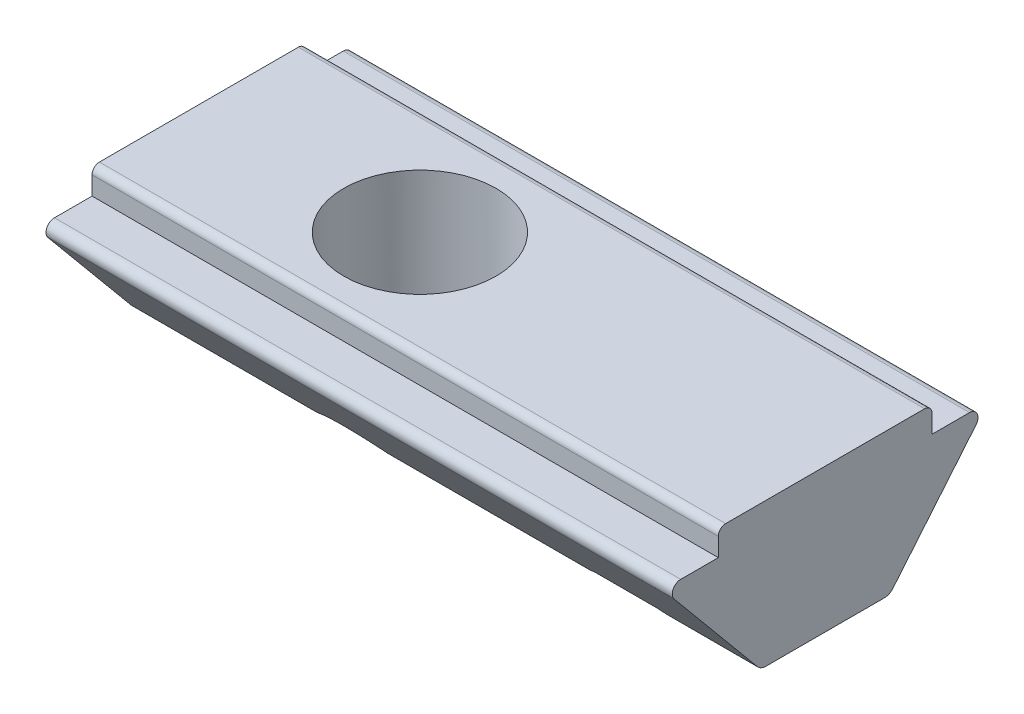
ISO-10303-21;
HEADER;
FILE_DESCRIPTION(('STEP AP214'),'2;1');
FILE_NAME('part.step','',(''),(''),'','','');
FILE_SCHEMA(('AUTOMOTIVE_DESIGN { 1 0 10303 214 1 1 1 1 }'));
ENDSEC;
DATA;
#1=APPLICATION_CONTEXT('core data for automotive mechanical design processes');
#2=APPLICATION_PROTOCOL_DEFINITION('international standard','automotive_design',2000,#1);
#3=PRODUCT_CONTEXT('',#1,'mechanical');
#4=PRODUCT('Part','Part','',(#3));
#5=PRODUCT_RELATED_PRODUCT_CATEGORY('part','',(#4));
#6=PRODUCT_DEFINITION_FORMATION('','',#4);
#7=PRODUCT_DEFINITION_CONTEXT('part definition',#1,'design');
#8=PRODUCT_DEFINITION('design','',#6,#7);
#9=PRODUCT_DEFINITION_SHAPE('','',#8);
#10=(LENGTH_UNIT() NAMED_UNIT(*) SI_UNIT(.MILLI.,.METRE.));
#11=(NAMED_UNIT(*) PLANE_ANGLE_UNIT() SI_UNIT($,.RADIAN.));
#12=(NAMED_UNIT(*) SI_UNIT($,.STERADIAN.) SOLID_ANGLE_UNIT());
#13=UNCERTAINTY_MEASURE_WITH_UNIT(LENGTH_MEASURE(1.E-05),#10,'distance_accuracy_value','');
#14=(GEOMETRIC_REPRESENTATION_CONTEXT(3) GLOBAL_UNCERTAINTY_ASSIGNED_CONTEXT((#13)) GLOBAL_UNIT_ASSIGNED_CONTEXT((#10,
#11,#12)) REPRESENTATION_CONTEXT('',''));
#15=CARTESIAN_POINT('',(0.,0.,0.));
#16=DIRECTION('',(0.,0.,1.));
#17=DIRECTION('',(1.,0.,0.));
#18=AXIS2_PLACEMENT_3D('',#15,#16,#17);
#19=CARTESIAN_POINT('',(11.,-3.9,1.75));
#20=DIRECTION('',(0.,1.,0.));
#21=DIRECTION('',(0.,0.,1.));
#22=AXIS2_PLACEMENT_3D('',#19,#20,#21);
#23=PLANE('',#22);
#24=DIRECTION('',(-1.,0.,0.));
#25=VECTOR('',#24,1.);
#26=CARTESIAN_POINT('',(11.,-3.9,1.60927283533169));
#27=LINE('',#26,#25);
#28=CARTESIAN_POINT('',(6.15083694778447,-3.9,1.60927283533169));
#29=VERTEX_POINT('',#28);
#30=CARTESIAN_POINT('',(1.29720080999956,-3.9,1.60927283533169));
#31=VERTEX_POINT('',#30);
#32=EDGE_CURVE('E365',#29,#31,#27,.T.);
#33=ORIENTED_EDGE('',*,*,#32,.T.);
#34=CARTESIAN_POINT('',(0.,-3.9,0.));
#35=DIRECTION('',(0.,1.,0.));
#36=DIRECTION('',(0.,0.,1.));
#37=AXIS2_PLACEMENT_3D('',#34,#35,#36);
#38=CIRCLE('',#37,2.067);
#39=CARTESIAN_POINT('',(1.29720080999955,-3.9,-1.60927283533169));
#40=VERTEX_POINT('',#39);
#41=EDGE_CURVE('E64',#31,#40,#38,.T.);
#42=ORIENTED_EDGE('',*,*,#41,.T.);
#43=DIRECTION('',(-1.,0.,0.));
#44=VECTOR('',#43,1.);
#45=CARTESIAN_POINT('',(11.,-3.9,-1.60927283533169));
#46=LINE('',#45,#44);
#47=CARTESIAN_POINT('',(6.15083694778448,-3.9,-1.60927283533169));
#48=VERTEX_POINT('',#47);
#49=EDGE_CURVE('E71',#40,#48,#46,.F.);
#50=ORIENTED_EDGE('',*,*,#49,.T.);
#51=CARTESIAN_POINT('',(7.5,-3.9,0.));
#52=DIRECTION('',(0.,1.,0.));
#53=DIRECTION('',(0.,0.,1.));
#54=AXIS2_PLACEMENT_3D('',#51,#52,#53);
#55=CIRCLE('',#54,2.1);
#56=EDGE_CURVE('E359',#48,#29,#55,.T.);
#57=ORIENTED_EDGE('',*,*,#56,.T.);
#58=EDGE_LOOP('',(#33,#42,#50,#57));
#59=FACE_BOUND('',#58,.T.);
#60=ADVANCED_FACE('F43',(#59),#23,.F.);
#61=CARTESIAN_POINT('',(11.,-3.6,-1.60927283533169));
#62=DIRECTION('',(-1.,0.,0.));
#63=DIRECTION('',(0.,0.,1.));
#64=AXIS2_PLACEMENT_3D('',#61,#62,#63);
#65=CYLINDRICAL_SURFACE('',#64,0.3);
#66=CARTESIAN_POINT('',(-1.29720080999955,-3.9,-1.60927283533169));
#67=CARTESIAN_POINT('',(-1.27974293237476,-3.89999128934075,-1.62334724323147));
#68=CARTESIAN_POINT('',(-1.2620737162754,-3.89901135164048,-1.63711891595062));
#69=CARTESIAN_POINT('',(-1.22642965644565,-3.89528120129688,-1.66398801441038));
#70=CARTESIAN_POINT('',(-1.20845504037879,-3.89253225547317,-1.67708591540852));
#71=CARTESIAN_POINT('',(-1.1549406520226,-3.88203082036834,-1.71478116309034));
#72=CARTESIAN_POINT('',(-1.1190971994342,-3.87200825235047,-1.73835221681893));
#73=CARTESIAN_POINT('',(-1.05957824577181,-3.85065115458066,-1.77498300902969));
#74=CARTESIAN_POINT('',(-1.03585557140469,-3.84088535441787,-1.7889158503905));
#75=CARTESIAN_POINT('',(-1.00043401580829,-3.82418669508058,-1.80881374381069));
#76=CARTESIAN_POINT('',(-0.988576784850685,-3.8182329207292,-1.8153187211507));
#77=CARTESIAN_POINT('',(-0.965041137451065,-3.80558184134619,-1.82793984997824));
#78=CARTESIAN_POINT('',(-0.95336285554577,-3.79888400539671,-1.83405571886375));
#79=CARTESIAN_POINT('',(-0.941817360790472,-3.79178475893633,-1.83996441783902));
#80=B_SPLINE_CURVE_WITH_KNOTS('',3,(#66,#67,#68,#69,#70,#71,#72,#73,#74,#75,#76,#77,#78,#79),
.UNSPECIFIED.,.F.,.F.,(4,2,2,2,2,2,4),(0.,0.0672080338937752,0.134367992342279,
0.265975595194617,0.353421910220517,0.39772945333734,0.442068817235654),.UNSPECIFIED.);
#81=CARTESIAN_POINT('',(-1.29720080999955,-3.9,-1.60927283533169));
#82=VERTEX_POINT('',#81);
#83=CARTESIAN_POINT('',(-0.941817360790466,-3.79178475893633,-1.83996441783902));
#84=VERTEX_POINT('',#83);
#85=EDGE_CURVE('E347',#82,#84,#80,.T.);
#86=ORIENTED_EDGE('',*,*,#85,.F.);
#87=CARTESIAN_POINT('',(-6.,-3.9,-1.60927283533169));
#88=VERTEX_POINT('',#87);
#89=EDGE_CURVE('E371',#88,#82,#46,.F.);
#90=ORIENTED_EDGE('',*,*,#89,.F.);
#91=CARTESIAN_POINT('',(-6.,-3.6,-1.60927283533169));
#92=DIRECTION('',(-1.,0.,0.));
#93=DIRECTION('',(0.,0.,1.));
#94=AXIS2_PLACEMENT_3D('',#91,#92,#93);
#95=CIRCLE('',#94,0.3);
#96=CARTESIAN_POINT('',(-6.,-3.79178475893633,-1.83996441783902));
#97=VERTEX_POINT('',#96);
#98=EDGE_CURVE('E370',#97,#88,#95,.T.);
#99=ORIENTED_EDGE('',*,*,#98,.F.);
#100=DIRECTION('',(-1.,0.,0.));
#101=VECTOR('',#100,1.);
#102=CARTESIAN_POINT('',(11.,-3.79178475893633,-1.83996441783902));
#103=LINE('',#102,#101);
#104=EDGE_CURVE('E241',#84,#97,#103,.T.);
#105=ORIENTED_EDGE('',*,*,#104,.F.);
#106=EDGE_LOOP('',(#86,#90,#99,#105));
#107=FACE_BOUND('',#106,.T.);
#108=ADVANCED_FACE('F494',(#107),#65,.T.);
#109=CARTESIAN_POINT('',(11.,-3.6,1.60927283533169));
#110=DIRECTION('',(-1.,0.,0.));
#111=DIRECTION('',(0.,0.,1.));
#112=AXIS2_PLACEMENT_3D('',#109,#110,#111);
#113=CYLINDRICAL_SURFACE('',#112,0.3);
#114=CARTESIAN_POINT('',(-0.941817360790473,-3.79178475893633,1.83996441783901));
#115=CARTESIAN_POINT('',(-0.959536967771565,-3.80264927398413,1.83089913523369));
#116=CARTESIAN_POINT('',(-0.977543826134357,-3.81260387629664,1.82135454319004));
#117=CARTESIAN_POINT('',(-1.0138983493778,-3.83083897464804,1.80136737059737));
#118=CARTESIAN_POINT('',(-1.0322459078334,-3.83911998417495,1.79092506688812));
#119=CARTESIAN_POINT('',(-1.06868991680062,-3.85400919668802,1.76941547577826));
#120=CARTESIAN_POINT('',(-1.08678401745704,-3.8606476347989,1.75836493608639));
#121=CARTESIAN_POINT('',(-1.12295598491964,-3.8724622644158,1.7354875396833));
#122=CARTESIAN_POINT('',(-1.14103385249653,-3.8776385294479,1.72366072204446));
#123=CARTESIAN_POINT('',(-1.18230339098004,-3.88776731923938,1.69571039796934));
#124=CARTESIAN_POINT('',(-1.2054537720449,-3.89221726967314,1.67933737075325));
#125=CARTESIAN_POINT('',(-1.251596475979,-3.8983382028379,1.64524687968425));
#126=CARTESIAN_POINT('',(-1.2745826924218,-3.89997177931288,1.62751453832146));
#127=CARTESIAN_POINT('',(-1.29720080999956,-3.9,1.60927283533169));
#128=B_SPLINE_CURVE_WITH_KNOTS('',3,(#114,#115,#116,#117,#118,#119,#120,#121,#122,#123,#124,
#125,#126,#127),.UNSPECIFIED.,.F.,.F.,(4,2,2,2,2,2,4),(0.,0.0679738673511678,0.135926847343073,
0.202516136311645,0.269102076209518,0.355046711932197,0.442124289355897),.UNSPECIFIED.);
#129=CARTESIAN_POINT('',(-0.94181736079047,-3.79178475893633,1.83996441783902));
#130=VERTEX_POINT('',#129);
#131=CARTESIAN_POINT('',(-1.29720080999956,-3.9,1.60927283533169));
#132=VERTEX_POINT('',#131);
#133=EDGE_CURVE('E11',#130,#132,#128,.T.);
#134=ORIENTED_EDGE('',*,*,#133,.F.);
#135=DIRECTION('',(-1.,0.,0.));
#136=VECTOR('',#135,1.);
#137=CARTESIAN_POINT('',(11.,-3.79178475893633,1.83996441783902));
#138=LINE('',#137,#136);
#139=CARTESIAN_POINT('',(-6.,-3.79178475893633,1.83996441783902));
#140=VERTEX_POINT('',#139);
#141=EDGE_CURVE('E225',#140,#130,#138,.F.);
#142=ORIENTED_EDGE('',*,*,#141,.F.);
#143=CARTESIAN_POINT('',(-6.,-3.6,1.60927283533169));
#144=DIRECTION('',(-1.,0.,0.));
#145=DIRECTION('',(0.,0.,1.));
#146=AXIS2_PLACEMENT_3D('',#143,#144,#145);
#147=CIRCLE('',#146,0.3);
#148=CARTESIAN_POINT('',(-6.,-3.9,1.60927283533169));
#149=VERTEX_POINT('',#148);
#150=EDGE_CURVE('E234',#149,#140,#147,.T.);
#151=ORIENTED_EDGE('',*,*,#150,.F.);
#152=EDGE_CURVE('E368',#132,#149,#27,.T.);
#153=ORIENTED_EDGE('',*,*,#152,.F.);
#154=EDGE_LOOP('',(#134,#142,#151,#153));
#155=FACE_BOUND('',#154,.T.);
#156=ADVANCED_FACE('F313',(#155),#113,.T.);
#157=CARTESIAN_POINT('',(7.5,-3.7,0.));
#158=DIRECTION('',(0.,-1.,0.));
#159=DIRECTION('',(0.,0.,-1.));
#160=AXIS2_PLACEMENT_3D('',#157,#158,#159);
#161=PLANE('',#160);
#162=DIRECTION('',(-1.,0.,0.));
#163=VECTOR('',#162,1.);
#164=CARTESIAN_POINT('',(11.,-3.7,1.9162694033756));
#165=LINE('',#164,#163);
#166=CARTESIAN_POINT('',(8.35901779590794,-3.7,1.9162694033756));
#167=VERTEX_POINT('',#166);
#168=CARTESIAN_POINT('',(6.64098220409206,-3.7,1.9162694033756));
#169=VERTEX_POINT('',#168);
#170=EDGE_CURVE('E448',#167,#169,#165,.T.);
#171=ORIENTED_EDGE('',*,*,#170,.T.);
#172=CARTESIAN_POINT('',(7.5,-3.7,0.));
#173=DIRECTION('',(0.,1.,0.));
#174=DIRECTION('',(0.,0.,1.));
#175=AXIS2_PLACEMENT_3D('',#172,#173,#174);
#176=CIRCLE('',#175,2.1);
#177=CARTESIAN_POINT('',(6.64098220409206,-3.7,-1.9162694033756));
#178=VERTEX_POINT('',#177);
#179=EDGE_CURVE('E356',#178,#169,#176,.T.);
#180=ORIENTED_EDGE('',*,*,#179,.F.);
#181=DIRECTION('',(1.,0.,0.));
#182=VECTOR('',#181,1.);
#183=CARTESIAN_POINT('',(11.,-3.7,-1.9162694033756));
#184=LINE('',#183,#182);
#185=CARTESIAN_POINT('',(8.35901779590794,-3.7,-1.9162694033756));
#186=VERTEX_POINT('',#185);
#187=EDGE_CURVE('E216',#178,#186,#184,.T.);
#188=ORIENTED_EDGE('',*,*,#187,.T.);
#189=EDGE_CURVE('E357',#167,#186,#176,.T.);
#190=ORIENTED_EDGE('',*,*,#189,.F.);
#191=EDGE_LOOP('',(#171,#180,#188,#190));
#192=FACE_BOUND('',#191,.T.);
#193=CARTESIAN_POINT('',(7.5,-3.7,0.));
#194=DIRECTION('',(0.,1.,0.));
#195=DIRECTION('',(0.,0.,1.));
#196=AXIS2_PLACEMENT_3D('',#193,#194,#195);
#197=CIRCLE('',#196,1.73205080756888);
#198=CARTESIAN_POINT('',(7.5,-3.7,1.73205080756888));
#199=VERTEX_POINT('',#198);
#200=EDGE_CURVE('E353',#199,#199,#197,.T.);
#201=ORIENTED_EDGE('',*,*,#200,.T.);
#202=EDGE_LOOP('',(#201));
#203=FACE_BOUND('',#202,.T.);
#204=ADVANCED_FACE('F288',(#192,#203),#161,.T.);
#205=CARTESIAN_POINT('',(11.,-1.07703498185118,4.09686354658895));
#206=DIRECTION('',(0.,0.639282529787763,-0.768971941691085));
#207=DIRECTION('',(0.,0.768971941691085,0.639282529787763));
#208=AXIS2_PLACEMENT_3D('',#205,#206,#207);
#209=PLANE('',#208);
#210=ORIENTED_EDGE('',*,*,#141,.T.);
#211=CARTESIAN_POINT('',(0.,-6.00501747702407,0.));
#212=DIRECTION('',(0.,0.639282529787763,-0.768971941691085));
#213=DIRECTION('',(0.,0.768971941691085,0.639282529787763));
#214=AXIS2_PLACEMENT_3D('',#211,#212,#213);
#215=ELLIPSE('',#214,3.23331219560501,2.067);
#216=CARTESIAN_POINT('',(0.941817360790473,-3.79178475893633,1.83996441783901));
#217=VERTEX_POINT('',#216);
#218=EDGE_CURVE('E210',#130,#217,#215,.T.);
#219=ORIENTED_EDGE('',*,*,#218,.T.);
#220=CARTESIAN_POINT('',(6.48780884162805,-3.79178475893633,1.83996441783901));
#221=VERTEX_POINT('',#220);
#222=EDGE_CURVE('E221',#217,#221,#138,.F.);
#223=ORIENTED_EDGE('',*,*,#222,.T.);
#224=CARTESIAN_POINT('',(7.5,-6.00501747702407,0.));
#225=DIRECTION('',(0.,0.639282529787763,-0.768971941691085));
#226=DIRECTION('',(0.,0.768971941691085,0.639282529787763));
#227=AXIS2_PLACEMENT_3D('',#224,#225,#226);
#228=ELLIPSE('',#227,3.28493256447534,2.1);
#229=EDGE_CURVE('E303',#169,#221,#228,.F.);
#230=ORIENTED_EDGE('',*,*,#229,.F.);
#231=ORIENTED_EDGE('',*,*,#170,.F.);
#232=CARTESIAN_POINT('',(8.51219115837194,-3.79178475893633,1.83996441783901));
#233=VERTEX_POINT('',#232);
#234=EDGE_CURVE('E469',#233,#167,#228,.F.);
#235=ORIENTED_EDGE('',*,*,#234,.F.);
#236=CARTESIAN_POINT('',(11.,-3.79178475893633,1.83996441783902));
#237=VERTEX_POINT('',#236);
#238=EDGE_CURVE('E231',#233,#237,#138,.F.);
#239=ORIENTED_EDGE('',*,*,#238,.T.);
#240=DIRECTION('',(0.,-0.768971941691085,-0.639282529787763));
#241=VECTOR('',#240,1.);
#242=CARTESIAN_POINT('',(11.,-1.07703498185118,4.09686354658895));
#243=LINE('',#242,#241);
#244=CARTESIAN_POINT('',(11.,-1.07703498185118,4.09686354658895));
#245=VERTEX_POINT('',#244);
#246=EDGE_CURVE('E456',#245,#237,#243,.T.);
#247=ORIENTED_EDGE('',*,*,#246,.F.);
#248=DIRECTION('',(-1.,0.,0.));
#249=VECTOR('',#248,1.);
#250=CARTESIAN_POINT('',(11.,-1.07703498185118,4.09686354658895));
#251=LINE('',#250,#249);
#252=CARTESIAN_POINT('',(-6.,-1.07703498185118,4.09686354658895));
#253=VERTEX_POINT('',#252);
#254=EDGE_CURVE('E391',#245,#253,#251,.T.);
#255=ORIENTED_EDGE('',*,*,#254,.T.);
#256=DIRECTION('',(0.,-0.768971941691085,-0.639282529787763));
#257=VECTOR('',#256,1.);
#258=CARTESIAN_POINT('',(-6.,-1.07703498185118,4.09686354658895));
#259=LINE('',#258,#257);
#260=EDGE_CURVE('E384',#253,#140,#259,.T.);
#261=ORIENTED_EDGE('',*,*,#260,.T.);
#262=EDGE_LOOP('',(#210,#219,#223,#230,#231,#235,#239,#247,#255,#261));
#263=FACE_BOUND('',#262,.T.);
#264=ADVANCED_FACE('F219',(#263),#209,.F.);
#265=ORIENTED_EDGE('',*,*,#89,.T.);
#266=EDGE_CURVE('E346',#82,#132,#38,.T.);
#267=ORIENTED_EDGE('',*,*,#266,.T.);
#268=ORIENTED_EDGE('',*,*,#152,.T.);
#269=DIRECTION('',(0.,0.,-1.));
#270=VECTOR('',#269,1.);
#271=CARTESIAN_POINT('',(-6.,-3.9,1.75));
#272=LINE('',#271,#270);
#273=EDGE_CURVE('E385',#149,#88,#272,.T.);
#274=ORIENTED_EDGE('',*,*,#273,.T.);
#275=EDGE_LOOP('',(#265,#267,#268,#274));
#276=FACE_BOUND('',#275,.T.);
#277=ADVANCED_FACE('F398',(#276),#23,.F.);
#278=CARTESIAN_POINT('',(8.84916305221553,-3.9,1.60927283533169));
#279=VERTEX_POINT('',#278);
#280=CARTESIAN_POINT('',(8.84916305221552,-3.9,-1.60927283533169));
#281=VERTEX_POINT('',#280);
#282=EDGE_CURVE('E360',#279,#281,#55,.T.);
#283=ORIENTED_EDGE('',*,*,#282,.T.);
#284=CARTESIAN_POINT('',(11.,-3.9,-1.60927283533169));
#285=VERTEX_POINT('',#284);
#286=EDGE_CURVE('E405',#281,#285,#46,.F.);
#287=ORIENTED_EDGE('',*,*,#286,.T.);
#288=DIRECTION('',(0.,0.,-1.));
#289=VECTOR('',#288,1.);
#290=CARTESIAN_POINT('',(11.,-3.9,1.75));
#291=LINE('',#290,#289);
#292=CARTESIAN_POINT('',(11.,-3.9,1.60927283533169));
#293=VERTEX_POINT('',#292);
#294=EDGE_CURVE('E454',#293,#285,#291,.T.);
#295=ORIENTED_EDGE('',*,*,#294,.F.);
#296=EDGE_CURVE('E367',#293,#279,#27,.T.);
#297=ORIENTED_EDGE('',*,*,#296,.T.);
#298=EDGE_LOOP('',(#283,#287,#295,#297));
#299=FACE_BOUND('',#298,.T.);
#300=ADVANCED_FACE('F482',(#299),#23,.F.);
#301=CARTESIAN_POINT('',(11.,-3.9,-1.75));
#302=DIRECTION('',(0.,0.639282529787763,0.768971941691085));
#303=DIRECTION('',(0.,-0.768971941691086,0.639282529787763));
#304=AXIS2_PLACEMENT_3D('',#301,#302,#303);
#305=PLANE('',#304);
#306=CARTESIAN_POINT('',(6.48780884162806,-3.79178475893633,-1.83996441783902));
#307=VERTEX_POINT('',#306);
#308=CARTESIAN_POINT('',(0.941817360790472,-3.79178475893633,-1.83996441783902));
#309=VERTEX_POINT('',#308);
#310=EDGE_CURVE('E246',#307,#309,#103,.T.);
#311=ORIENTED_EDGE('',*,*,#310,.T.);
#312=CARTESIAN_POINT('',(0.,-6.00501747702407,0.));
#313=DIRECTION('',(0.,0.639282529787763,0.768971941691085));
#314=DIRECTION('',(0.,0.768971941691086,-0.639282529787763));
#315=AXIS2_PLACEMENT_3D('',#312,#313,#314);
#316=ELLIPSE('',#315,3.23331219560501,2.067);
#317=EDGE_CURVE('E344',#309,#84,#316,.T.);
#318=ORIENTED_EDGE('',*,*,#317,.T.);
#319=ORIENTED_EDGE('',*,*,#104,.T.);
#320=DIRECTION('',(0.,0.768971941691086,-0.639282529787763));
#321=VECTOR('',#320,1.);
#322=CARTESIAN_POINT('',(-6.,-3.9,-1.75));
#323=LINE('',#322,#321);
#324=CARTESIAN_POINT('',(-6.,-1.07703498185118,-4.09686354658895));
#325=VERTEX_POINT('',#324);
#326=EDGE_CURVE('E434',#97,#325,#323,.T.);
#327=ORIENTED_EDGE('',*,*,#326,.T.);
#328=DIRECTION('',(-1.,0.,0.));
#329=VECTOR('',#328,1.);
#330=CARTESIAN_POINT('',(11.,-1.07703498185118,-4.09686354658895));
#331=LINE('',#330,#329);
#332=CARTESIAN_POINT('',(11.,-1.07703498185118,-4.09686354658895));
#333=VERTEX_POINT('',#332);
#334=EDGE_CURVE('E419',#333,#325,#331,.T.);
#335=ORIENTED_EDGE('',*,*,#334,.F.);
#336=DIRECTION('',(0.,0.768971941691086,-0.639282529787763));
#337=VECTOR('',#336,1.);
#338=CARTESIAN_POINT('',(11.,-3.9,-1.75));
#339=LINE('',#338,#337);
#340=CARTESIAN_POINT('',(11.,-3.79178475893633,-1.83996441783902));
#341=VERTEX_POINT('',#340);
#342=EDGE_CURVE('E452',#341,#333,#339,.T.);
#343=ORIENTED_EDGE('',*,*,#342,.F.);
#344=CARTESIAN_POINT('',(8.51219115837194,-3.79178475893633,-1.83996441783902));
#345=VERTEX_POINT('',#344);
#346=EDGE_CURVE('E242',#341,#345,#103,.T.);
#347=ORIENTED_EDGE('',*,*,#346,.T.);
#348=CARTESIAN_POINT('',(7.5,-6.00501747702407,0.));
#349=DIRECTION('',(0.,0.639282529787763,0.768971941691085));
#350=DIRECTION('',(0.,0.768971941691086,-0.639282529787763));
#351=AXIS2_PLACEMENT_3D('',#348,#349,#350);
#352=ELLIPSE('',#351,3.28493256447534,2.1);
#353=EDGE_CURVE('E304',#186,#345,#352,.F.);
#354=ORIENTED_EDGE('',*,*,#353,.F.);
#355=ORIENTED_EDGE('',*,*,#187,.F.);
#356=EDGE_CURVE('E305',#307,#178,#352,.F.);
#357=ORIENTED_EDGE('',*,*,#356,.F.);
#358=EDGE_LOOP('',(#311,#318,#319,#327,#335,#343,#347,#354,#355,#357));
#359=FACE_BOUND('',#358,.T.);
#360=ADVANCED_FACE('F311',(#359),#305,.F.);
#361=ORIENTED_EDGE('',*,*,#238,.F.);
#362=CARTESIAN_POINT('',(8.51219115837194,-3.79178475893633,1.83996441783901));
#363=CARTESIAN_POINT('',(8.52800442365884,-3.80221006430888,1.83126951991368));
#364=CARTESIAN_POINT('',(8.54411215779907,-3.81178506566316,1.82213898292123));
#365=CARTESIAN_POINT('',(8.57669033559653,-3.82937090988923,1.80307780916895));
#366=CARTESIAN_POINT('',(8.5931605393776,-3.83738275453271,1.79314769063603));
#367=CARTESIAN_POINT('',(8.62592345109863,-3.85184396854946,1.77275560922012));
#368=CARTESIAN_POINT('',(8.64221300683949,-3.8583216741598,1.76230847417787));
#369=CARTESIAN_POINT('',(8.67482269246242,-3.86993811339133,1.74073956556206));
#370=CARTESIAN_POINT('',(8.69114282545044,-3.87507670262788,1.72961771939983));
#371=CARTESIAN_POINT('',(8.73123818780165,-3.88605773923451,1.70143933606845));
#372=CARTESIAN_POINT('',(8.75497432804617,-3.89112861619413,1.68401481126825));
#373=CARTESIAN_POINT('',(8.80233510271543,-3.89810641303652,1.6476768027842));
#374=CARTESIAN_POINT('',(8.82595264930398,-3.8999644329173,1.62874481806492));
#375=CARTESIAN_POINT('',(8.84916305221553,-3.9,1.60927283533169));
#376=B_SPLINE_CURVE_WITH_KNOTS('',3,(#362,#363,#364,#365,#366,#367,#368,#369,#370,#371,#372,
#373,#374,#375),.UNSPECIFIED.,.F.,.F.,(4,2,2,2,2,2,4),(0.,0.0624695945832404,0.124899022160282,
0.186065188171721,0.247237946444278,0.336671790362523,0.427455223608033),.UNSPECIFIED.);
#377=EDGE_CURVE('E319',#233,#279,#376,.T.);
#378=ORIENTED_EDGE('',*,*,#377,.T.);
#379=ORIENTED_EDGE('',*,*,#296,.F.);
#380=CARTESIAN_POINT('',(11.,-3.6,1.60927283533169));
#381=DIRECTION('',(-1.,0.,0.));
#382=DIRECTION('',(0.,0.,1.));
#383=AXIS2_PLACEMENT_3D('',#380,#381,#382);
#384=CIRCLE('',#383,0.3);
#385=EDGE_CURVE('E239',#237,#293,#384,.F.);
#386=ORIENTED_EDGE('',*,*,#385,.F.);
#387=EDGE_LOOP('',(#361,#378,#379,#386));
#388=FACE_BOUND('',#387,.T.);
#389=ADVANCED_FACE('F307',(#388),#113,.T.);
#390=CARTESIAN_POINT('',(1.29720080999956,-3.9,1.60927283533169));
#391=CARTESIAN_POINT('',(1.27974293237476,-3.89999128934075,1.62334724323147));
#392=CARTESIAN_POINT('',(1.2620737162754,-3.89901135164048,1.63711891595062));
#393=CARTESIAN_POINT('',(1.22642965644565,-3.89528120129688,1.66398801441038));
#394=CARTESIAN_POINT('',(1.20845504037879,-3.89253225547317,1.67708591540852));
#395=CARTESIAN_POINT('',(1.1549406520226,-3.88203082036834,1.71478116309034));
#396=CARTESIAN_POINT('',(1.11909719943421,-3.87200825235047,1.73835221681893));
#397=CARTESIAN_POINT('',(1.05957824577181,-3.85065115458066,1.77498300902969));
#398=CARTESIAN_POINT('',(1.03585557140469,-3.84088535441787,1.7889158503905));
#399=CARTESIAN_POINT('',(1.00043401580829,-3.82418669508058,1.80881374381068));
#400=CARTESIAN_POINT('',(0.988576784850686,-3.8182329207292,1.8153187211507));
#401=CARTESIAN_POINT('',(0.965041137451066,-3.80558184134619,1.82793984997824));
#402=CARTESIAN_POINT('',(0.953362855545771,-3.79888400539671,1.83405571886374));
#403=CARTESIAN_POINT('',(0.941817360790473,-3.79178475893633,1.83996441783901));
#404=B_SPLINE_CURVE_WITH_KNOTS('',3,(#390,#391,#392,#393,#394,#395,#396,#397,#398,#399,#400,
#401,#402,#403),.UNSPECIFIED.,.F.,.F.,(4,2,2,2,2,2,4),(0.,0.067208033893775,0.134367992342279,
0.265975595194616,0.353421910220516,0.39772945333734,0.442068817235654),.UNSPECIFIED.);
#405=EDGE_CURVE('E57',#31,#217,#404,.T.);
#406=ORIENTED_EDGE('',*,*,#405,.F.);
#407=ORIENTED_EDGE('',*,*,#32,.F.);
#408=CARTESIAN_POINT('',(6.15083694778447,-3.9,1.60927283533169));
#409=CARTESIAN_POINT('',(6.16726314874561,-3.89999221448579,1.62304590694146));
#410=CARTESIAN_POINT('',(6.18388440749588,-3.89905306790869,1.63655005408616));
#411=CARTESIAN_POINT('',(6.21740653841518,-3.89546028494459,1.66295161336739));
#412=CARTESIAN_POINT('',(6.23430723127831,-3.8928077093669,1.67584939561672));
#413=CARTESIAN_POINT('',(6.28456584016906,-3.88264720849691,1.71301672945264));
#414=CARTESIAN_POINT('',(6.31819219915266,-3.87292210907077,1.73635443388923));
#415=CARTESIAN_POINT('',(6.37461878820967,-3.85183731426433,1.77320899292095));
#416=CARTESIAN_POINT('',(6.39748587759531,-3.84196257495056,1.78750052544176));
#417=CARTESIAN_POINT('',(6.4315674646954,-3.82497352043113,1.80793544123543));
#418=CARTESIAN_POINT('',(6.44297224110469,-3.81889620056429,1.81462415998937));
#419=CARTESIAN_POINT('',(6.46557219007116,-3.80595034421082,1.82760230285763));
#420=CARTESIAN_POINT('',(6.47676718075581,-3.79908115504866,1.83389139086946));
#421=CARTESIAN_POINT('',(6.48780884162805,-3.79178475893633,1.83996441783902));
#422=B_SPLINE_CURVE_WITH_KNOTS('',3,(#408,#409,#410,#411,#412,#413,#414,#415,#416,#417,#418,
#419,#420,#421),.UNSPECIFIED.,.F.,.F.,(4,2,2,2,2,2,4),(0.,0.0642474402939419,0.128455142119495,
0.254120267545124,0.340118608935548,0.383746420830759,0.427410452321446),.UNSPECIFIED.);
#423=EDGE_CURVE('E230',#29,#221,#422,.T.);
#424=ORIENTED_EDGE('',*,*,#423,.T.);
#425=ORIENTED_EDGE('',*,*,#222,.F.);
#426=EDGE_LOOP('',(#406,#407,#424,#425));
#427=FACE_BOUND('',#426,.T.);
#428=ADVANCED_FACE('F229',(#427),#113,.T.);
#429=ORIENTED_EDGE('',*,*,#286,.F.);
#430=CARTESIAN_POINT('',(8.84916305221552,-3.9,-1.60927283533169));
#431=CARTESIAN_POINT('',(8.83273685125439,-3.89999221448579,-1.62304590694146));
#432=CARTESIAN_POINT('',(8.81611559250412,-3.89905306790869,-1.63655005408616));
#433=CARTESIAN_POINT('',(8.78259346158482,-3.89546028494459,-1.66295161336739));
#434=CARTESIAN_POINT('',(8.76569276872169,-3.8928077093669,-1.67584939561672));
#435=CARTESIAN_POINT('',(8.71543415983094,-3.88264720849691,-1.71301672945264));
#436=CARTESIAN_POINT('',(8.68180780084734,-3.87292210907077,-1.73635443388923));
#437=CARTESIAN_POINT('',(8.62538121179033,-3.85183731426433,-1.77320899292095));
#438=CARTESIAN_POINT('',(8.60251412240469,-3.84196257495057,-1.78750052544176));
#439=CARTESIAN_POINT('',(8.5684325353046,-3.82497352043113,-1.80793544123543));
#440=CARTESIAN_POINT('',(8.55702775889531,-3.81889620056429,-1.81462415998937));
#441=CARTESIAN_POINT('',(8.53442780992884,-3.80595034421082,-1.82760230285763));
#442=CARTESIAN_POINT('',(8.52323281924419,-3.79908115504866,-1.83389139086946));
#443=CARTESIAN_POINT('',(8.51219115837194,-3.79178475893633,-1.83996441783902));
#444=B_SPLINE_CURVE_WITH_KNOTS('',3,(#430,#431,#432,#433,#434,#435,#436,#437,#438,#439,#440,
#441,#442,#443),.UNSPECIFIED.,.F.,.F.,(4,2,2,2,2,2,4),(0.,0.0642474402939427,0.128455142119496,
0.254120267545124,0.340118608935546,0.383746420830758,0.427410452321446),.UNSPECIFIED.);
#445=EDGE_CURVE('E273',#281,#345,#444,.T.);
#446=ORIENTED_EDGE('',*,*,#445,.T.);
#447=ORIENTED_EDGE('',*,*,#346,.F.);
#448=CARTESIAN_POINT('',(11.,-3.6,-1.60927283533169));
#449=DIRECTION('',(-1.,0.,0.));
#450=DIRECTION('',(0.,0.,1.));
#451=AXIS2_PLACEMENT_3D('',#448,#449,#450);
#452=CIRCLE('',#451,0.3);
#453=EDGE_CURVE('E233',#285,#341,#452,.F.);
#454=ORIENTED_EDGE('',*,*,#453,.F.);
#455=EDGE_LOOP('',(#429,#446,#447,#454));
#456=FACE_BOUND('',#455,.T.);
#457=ADVANCED_FACE('F279',(#456),#65,.T.);
#458=CARTESIAN_POINT('',(0.941817360790472,-3.79178475893633,-1.83996441783902));
#459=CARTESIAN_POINT('',(0.959536967771564,-3.80264927398413,-1.83089913523369));
#460=CARTESIAN_POINT('',(0.977543826134355,-3.81260387629664,-1.82135454319004));
#461=CARTESIAN_POINT('',(1.0138983493778,-3.83083897464804,-1.80136737059737));
#462=CARTESIAN_POINT('',(1.0322459078334,-3.83911998417495,-1.79092506688812));
#463=CARTESIAN_POINT('',(1.06868991680062,-3.85400919668802,-1.76941547577826));
#464=CARTESIAN_POINT('',(1.08678401745704,-3.8606476347989,-1.7583649360864));
#465=CARTESIAN_POINT('',(1.12295598491964,-3.8724622644158,-1.7354875396833));
#466=CARTESIAN_POINT('',(1.14103385249653,-3.8776385294479,-1.72366072204446));
#467=CARTESIAN_POINT('',(1.18230339098004,-3.88776731923938,-1.69571039796934));
#468=CARTESIAN_POINT('',(1.2054537720449,-3.89221726967314,-1.67933737075325));
#469=CARTESIAN_POINT('',(1.251596475979,-3.8983382028379,-1.64524687968425));
#470=CARTESIAN_POINT('',(1.2745826924218,-3.89997177931288,-1.62751453832147));
#471=CARTESIAN_POINT('',(1.29720080999955,-3.9,-1.60927283533169));
#472=B_SPLINE_CURVE_WITH_KNOTS('',3,(#458,#459,#460,#461,#462,#463,#464,#465,#466,#467,#468,
#469,#470,#471),.UNSPECIFIED.,.F.,.F.,(4,2,2,2,2,2,4),(0.,0.0679738673511678,0.135926847343074,
0.202516136311646,0.269102076209518,0.355046711932198,0.442124289355896),.UNSPECIFIED.);
#473=EDGE_CURVE('E337',#309,#40,#472,.T.);
#474=ORIENTED_EDGE('',*,*,#473,.F.);
#475=ORIENTED_EDGE('',*,*,#310,.F.);
#476=CARTESIAN_POINT('',(6.48780884162806,-3.79178475893633,-1.83996441783902));
#477=CARTESIAN_POINT('',(6.47199557634116,-3.80221006430888,-1.83126951991368));
#478=CARTESIAN_POINT('',(6.45588784220094,-3.81178506566316,-1.82213898292123));
#479=CARTESIAN_POINT('',(6.42330966440348,-3.82937090988923,-1.80307780916895));
#480=CARTESIAN_POINT('',(6.4068394606224,-3.83738275453271,-1.79314769063603));
#481=CARTESIAN_POINT('',(6.37407654890137,-3.85184396854946,-1.77275560922013));
#482=CARTESIAN_POINT('',(6.35778699316051,-3.8583216741598,-1.76230847417787));
#483=CARTESIAN_POINT('',(6.32517730753758,-3.86993811339133,-1.74073956556206));
#484=CARTESIAN_POINT('',(6.30885717454956,-3.87507670262788,-1.72961771939983));
#485=CARTESIAN_POINT('',(6.26876181219835,-3.88605773923451,-1.70143933606846));
#486=CARTESIAN_POINT('',(6.24502567195383,-3.89112861619413,-1.68401481126825));
#487=CARTESIAN_POINT('',(6.19766489728457,-3.89810641303652,-1.6476768027842));
#488=CARTESIAN_POINT('',(6.17404735069602,-3.8999644329173,-1.62874481806492));
#489=CARTESIAN_POINT('',(6.15083694778448,-3.9,-1.60927283533169));
#490=B_SPLINE_CURVE_WITH_KNOTS('',3,(#476,#477,#478,#479,#480,#481,#482,#483,#484,#485,#486,
#487,#488,#489),.UNSPECIFIED.,.F.,.F.,(4,2,2,2,2,2,4),(0.,0.062469594583239,0.124899022160283,
0.186065188171722,0.247237946444279,0.336671790362524,0.427455223608031),.UNSPECIFIED.);
#491=EDGE_CURVE('E264',#307,#48,#490,.T.);
#492=ORIENTED_EDGE('',*,*,#491,.T.);
#493=ORIENTED_EDGE('',*,*,#49,.F.);
#494=EDGE_LOOP('',(#474,#475,#492,#493));
#495=FACE_BOUND('',#494,.T.);
#496=ADVANCED_FACE('F402',(#495),#65,.T.);
#497=CARTESIAN_POINT('',(11.,-0.699999999999999,-2.9));
#498=DIRECTION('',(0.,0.,1.));
#499=DIRECTION('',(0.,-1.,0.));
#500=AXIS2_PLACEMENT_3D('',#497,#498,#499);
#501=PLANE('',#500);
#502=DIRECTION('',(0.,1.,0.));
#503=VECTOR('',#502,1.);
#504=CARTESIAN_POINT('',(-6.,-0.699999999999999,-2.9));
#505=LINE('',#504,#503);
#506=CARTESIAN_POINT('',(-6.,-0.699999999999999,-2.9));
#507=VERTEX_POINT('',#506);
#508=CARTESIAN_POINT('',(-6.,-0.2,-2.9));
#509=VERTEX_POINT('',#508);
#510=EDGE_CURVE('E445',#507,#509,#505,.T.);
#511=ORIENTED_EDGE('',*,*,#510,.T.);
#512=DIRECTION('',(-1.,0.,0.));
#513=VECTOR('',#512,1.);
#514=CARTESIAN_POINT('',(11.,-0.2,-2.9));
#515=LINE('',#514,#513);
#516=CARTESIAN_POINT('',(11.,-0.2,-2.9));
#517=VERTEX_POINT('',#516);
#518=EDGE_CURVE('E262',#509,#517,#515,.F.);
#519=ORIENTED_EDGE('',*,*,#518,.T.);
#520=DIRECTION('',(0.,1.,0.));
#521=VECTOR('',#520,1.);
#522=CARTESIAN_POINT('',(11.,-0.699999999999999,-2.9));
#523=LINE('',#522,#521);
#524=CARTESIAN_POINT('',(11.,-0.699999999999999,-2.9));
#525=VERTEX_POINT('',#524);
#526=EDGE_CURVE('E431',#525,#517,#523,.T.);
#527=ORIENTED_EDGE('',*,*,#526,.F.);
#528=DIRECTION('',(-1.,0.,0.));
#529=VECTOR('',#528,1.);
#530=CARTESIAN_POINT('',(11.,-0.699999999999999,-2.9));
#531=LINE('',#530,#529);
#532=EDGE_CURVE('E425',#525,#507,#531,.T.);
#533=ORIENTED_EDGE('',*,*,#532,.T.);
#534=EDGE_LOOP('',(#511,#519,#527,#533));
#535=FACE_BOUND('',#534,.T.);
#536=ADVANCED_FACE('F314',(#535),#501,.F.);
#537=CARTESIAN_POINT('',(11.,0.,-2.9));
#538=DIRECTION('',(0.,-1.,0.));
#539=DIRECTION('',(0.,0.,-1.));
#540=AXIS2_PLACEMENT_3D('',#537,#538,#539);
#541=PLANE('',#540);
#542=CARTESIAN_POINT('',(0.,0.,0.));
#543=DIRECTION('',(0.,1.,0.));
#544=DIRECTION('',(0.,0.,1.));
#545=AXIS2_PLACEMENT_3D('',#542,#543,#544);
#546=CIRCLE('',#545,2.067);
#547=CARTESIAN_POINT('',(0.,0.,2.067));
#548=VERTEX_POINT('',#547);
#549=EDGE_CURVE('E226',#548,#548,#546,.T.);
#550=ORIENTED_EDGE('',*,*,#549,.F.);
#551=EDGE_LOOP('',(#550));
#552=FACE_BOUND('',#551,.T.);
#553=DIRECTION('',(0.,0.,1.));
#554=VECTOR('',#553,1.);
#555=CARTESIAN_POINT('',(-6.,0.,-2.9));
#556=LINE('',#555,#554);
#557=CARTESIAN_POINT('',(-6.,0.,-2.7));
#558=VERTEX_POINT('',#557);
#559=CARTESIAN_POINT('',(-6.,0.,2.7));
#560=VERTEX_POINT('',#559);
#561=EDGE_CURVE('E442',#558,#560,#556,.T.);
#562=ORIENTED_EDGE('',*,*,#561,.T.);
#563=DIRECTION('',(-1.,0.,0.));
#564=VECTOR('',#563,1.);
#565=CARTESIAN_POINT('',(11.,0.,2.7));
#566=LINE('',#565,#564);
#567=CARTESIAN_POINT('',(11.,0.,2.7));
#568=VERTEX_POINT('',#567);
#569=EDGE_CURVE('E256',#560,#568,#566,.F.);
#570=ORIENTED_EDGE('',*,*,#569,.T.);
#571=DIRECTION('',(0.,0.,1.));
#572=VECTOR('',#571,1.);
#573=CARTESIAN_POINT('',(11.,0.,-2.9));
#574=LINE('',#573,#572);
#575=CARTESIAN_POINT('',(11.,0.,-2.7));
#576=VERTEX_POINT('',#575);
#577=EDGE_CURVE('E465',#576,#568,#574,.T.);
#578=ORIENTED_EDGE('',*,*,#577,.F.);
#579=DIRECTION('',(-1.,0.,0.));
#580=VECTOR('',#579,1.);
#581=CARTESIAN_POINT('',(11.,0.,-2.7));
#582=LINE('',#581,#580);
#583=EDGE_CURVE('E253',#576,#558,#582,.T.);
#584=ORIENTED_EDGE('',*,*,#583,.T.);
#585=EDGE_LOOP('',(#562,#570,#578,#584));
#586=FACE_BOUND('',#585,.T.);
#587=ADVANCED_FACE('F534',(#552,#586),#541,.F.);
#588=CARTESIAN_POINT('',(11.,0.,2.9));
#589=DIRECTION('',(0.,0.,-1.));
#590=DIRECTION('',(0.,1.,0.));
#591=AXIS2_PLACEMENT_3D('',#588,#589,#590);
#592=PLANE('',#591);
#593=DIRECTION('',(0.,-1.,0.));
#594=VECTOR('',#593,1.);
#595=CARTESIAN_POINT('',(11.,0.,2.9));
#596=LINE('',#595,#594);
#597=CARTESIAN_POINT('',(11.,-0.2,2.9));
#598=VERTEX_POINT('',#597);
#599=CARTESIAN_POINT('',(11.,-0.699999999999999,2.9));
#600=VERTEX_POINT('',#599);
#601=EDGE_CURVE('E463',#598,#600,#596,.T.);
#602=ORIENTED_EDGE('',*,*,#601,.F.);
#603=DIRECTION('',(-1.,0.,0.));
#604=VECTOR('',#603,1.);
#605=CARTESIAN_POINT('',(11.,-0.2,2.9));
#606=LINE('',#605,#604);
#607=CARTESIAN_POINT('',(-6.,-0.2,2.9));
#608=VERTEX_POINT('',#607);
#609=EDGE_CURVE('E245',#598,#608,#606,.T.);
#610=ORIENTED_EDGE('',*,*,#609,.T.);
#611=DIRECTION('',(0.,-1.,0.));
#612=VECTOR('',#611,1.);
#613=CARTESIAN_POINT('',(-6.,0.,2.9));
#614=LINE('',#613,#612);
#615=CARTESIAN_POINT('',(-6.,-0.699999999999999,2.9));
#616=VERTEX_POINT('',#615);
#617=EDGE_CURVE('E440',#608,#616,#614,.T.);
#618=ORIENTED_EDGE('',*,*,#617,.T.);
#619=DIRECTION('',(-1.,0.,0.));
#620=VECTOR('',#619,1.);
#621=CARTESIAN_POINT('',(11.,-0.699999999999999,2.9));
#622=LINE('',#621,#620);
#623=EDGE_CURVE('E406',#600,#616,#622,.T.);
#624=ORIENTED_EDGE('',*,*,#623,.F.);
#625=EDGE_LOOP('',(#602,#610,#618,#624));
#626=FACE_BOUND('',#625,.T.);
#627=ADVANCED_FACE('F542',(#626),#592,.F.);
#628=CARTESIAN_POINT('',(11.,-0.699999999999999,2.9));
#629=DIRECTION('',(0.,-1.,0.));
#630=DIRECTION('',(0.,0.,-1.));
#631=AXIS2_PLACEMENT_3D('',#628,#629,#630);
#632=PLANE('',#631);
#633=DIRECTION('',(0.,0.,1.));
#634=VECTOR('',#633,1.);
#635=CARTESIAN_POINT('',(-6.,-0.699999999999999,2.9));
#636=LINE('',#635,#634);
#637=CARTESIAN_POINT('',(-6.,-0.699999999999999,3.92));
#638=VERTEX_POINT('',#637);
#639=EDGE_CURVE('E438',#616,#638,#636,.T.);
#640=ORIENTED_EDGE('',*,*,#639,.T.);
#641=DIRECTION('',(-1.,0.,0.));
#642=VECTOR('',#641,1.);
#643=CARTESIAN_POINT('',(11.,-0.699999999999999,3.92));
#644=LINE('',#643,#642);
#645=CARTESIAN_POINT('',(11.,-0.699999999999999,3.92));
#646=VERTEX_POINT('',#645);
#647=EDGE_CURVE('E410',#646,#638,#644,.T.);
#648=ORIENTED_EDGE('',*,*,#647,.F.);
#649=DIRECTION('',(0.,0.,1.));
#650=VECTOR('',#649,1.);
#651=CARTESIAN_POINT('',(11.,-0.699999999999999,2.9));
#652=LINE('',#651,#650);
#653=EDGE_CURVE('E461',#600,#646,#652,.T.);
#654=ORIENTED_EDGE('',*,*,#653,.F.);
#655=ORIENTED_EDGE('',*,*,#623,.T.);
#656=EDGE_LOOP('',(#640,#648,#654,#655));
#657=FACE_BOUND('',#656,.T.);
#658=ADVANCED_FACE('F544',(#657),#632,.F.);
#659=CARTESIAN_POINT('',(11.,-0.929999999999999,3.92));
#660=DIRECTION('',(-1.,0.,0.));
#661=DIRECTION('',(0.,0.,1.));
#662=AXIS2_PLACEMENT_3D('',#659,#660,#661);
#663=CYLINDRICAL_SURFACE('',#662,0.23);
#664=CARTESIAN_POINT('',(-6.,-0.929999999999999,3.92));
#665=DIRECTION('',(1.,0.,0.));
#666=DIRECTION('',(0.,0.,1.));
#667=AXIS2_PLACEMENT_3D('',#664,#665,#666);
#668=CIRCLE('',#667,0.23);
#669=EDGE_CURVE('E392',#638,#253,#668,.T.);
#670=ORIENTED_EDGE('',*,*,#669,.T.);
#671=ORIENTED_EDGE('',*,*,#254,.F.);
#672=CARTESIAN_POINT('',(11.,-0.929999999999999,3.92));
#673=DIRECTION('',(1.,0.,0.));
#674=DIRECTION('',(0.,0.,1.));
#675=AXIS2_PLACEMENT_3D('',#672,#673,#674);
#676=CIRCLE('',#675,0.23);
#677=EDGE_CURVE('E459',#646,#245,#676,.T.);
#678=ORIENTED_EDGE('',*,*,#677,.F.);
#679=ORIENTED_EDGE('',*,*,#647,.T.);
#680=EDGE_LOOP('',(#670,#671,#678,#679));
#681=FACE_BOUND('',#680,.T.);
#682=ADVANCED_FACE('F547',(#681),#663,.T.);
#683=CARTESIAN_POINT('',(11.,-0.929999999999999,-3.92));
#684=DIRECTION('',(-1.,0.,0.));
#685=DIRECTION('',(0.,0.,1.));
#686=AXIS2_PLACEMENT_3D('',#683,#684,#685);
#687=CYLINDRICAL_SURFACE('',#686,0.23);
#688=CARTESIAN_POINT('',(-6.,-0.929999999999999,-3.92));
#689=DIRECTION('',(1.,0.,0.));
#690=DIRECTION('',(0.,0.,-1.));
#691=AXIS2_PLACEMENT_3D('',#688,#689,#690);
#692=CIRCLE('',#691,0.23);
#693=CARTESIAN_POINT('',(-6.,-0.699999999999999,-3.92));
#694=VERTEX_POINT('',#693);
#695=EDGE_CURVE('E432',#325,#694,#692,.T.);
#696=ORIENTED_EDGE('',*,*,#695,.T.);
#697=DIRECTION('',(-1.,0.,0.));
#698=VECTOR('',#697,1.);
#699=CARTESIAN_POINT('',(11.,-0.699999999999999,-3.92));
#700=LINE('',#699,#698);
#701=CARTESIAN_POINT('',(11.,-0.699999999999999,-3.92));
#702=VERTEX_POINT('',#701);
#703=EDGE_CURVE('E422',#702,#694,#700,.T.);
#704=ORIENTED_EDGE('',*,*,#703,.F.);
#705=CARTESIAN_POINT('',(11.,-0.929999999999999,-3.92));
#706=DIRECTION('',(1.,0.,0.));
#707=DIRECTION('',(0.,0.,-1.));
#708=AXIS2_PLACEMENT_3D('',#705,#706,#707);
#709=CIRCLE('',#708,0.23);
#710=EDGE_CURVE('E450',#333,#702,#709,.T.);
#711=ORIENTED_EDGE('',*,*,#710,.F.);
#712=ORIENTED_EDGE('',*,*,#334,.T.);
#713=EDGE_LOOP('',(#696,#704,#711,#712));
#714=FACE_BOUND('',#713,.T.);
#715=ADVANCED_FACE('F518',(#714),#687,.T.);
#716=CARTESIAN_POINT('',(11.,-0.699999999999999,-3.92));
#717=DIRECTION('',(0.,-1.,0.));
#718=DIRECTION('',(0.,0.,-1.));
#719=AXIS2_PLACEMENT_3D('',#716,#717,#718);
#720=PLANE('',#719);
#721=DIRECTION('',(0.,0.,1.));
#722=VECTOR('',#721,1.);
#723=CARTESIAN_POINT('',(-6.,-0.699999999999999,-3.92));
#724=LINE('',#723,#722);
#725=EDGE_CURVE('E429',#694,#507,#724,.T.);
#726=ORIENTED_EDGE('',*,*,#725,.T.);
#727=ORIENTED_EDGE('',*,*,#532,.F.);
#728=DIRECTION('',(0.,0.,1.));
#729=VECTOR('',#728,1.);
#730=CARTESIAN_POINT('',(11.,-0.699999999999999,-3.92));
#731=LINE('',#730,#729);
#732=EDGE_CURVE('E428',#702,#525,#731,.T.);
#733=ORIENTED_EDGE('',*,*,#732,.F.);
#734=ORIENTED_EDGE('',*,*,#703,.T.);
#735=EDGE_LOOP('',(#726,#727,#733,#734));
#736=FACE_BOUND('',#735,.T.);
#737=ADVANCED_FACE('F524',(#736),#720,.F.);
#738=CARTESIAN_POINT('',(11.,-0.929999999999999,3.92));
#739=DIRECTION('',(-1.,0.,0.));
#740=DIRECTION('',(0.,0.,1.));
#741=AXIS2_PLACEMENT_3D('',#738,#739,#740);
#742=PLANE('',#741);
#743=ORIENTED_EDGE('',*,*,#577,.T.);
#744=CARTESIAN_POINT('',(11.,-0.2,2.7));
#745=DIRECTION('',(-1.,0.,0.));
#746=DIRECTION('',(0.,0.,1.));
#747=AXIS2_PLACEMENT_3D('',#744,#745,#746);
#748=CIRCLE('',#747,0.2);
#749=EDGE_CURVE('E260',#568,#598,#748,.F.);
#750=ORIENTED_EDGE('',*,*,#749,.T.);
#751=ORIENTED_EDGE('',*,*,#601,.T.);
#752=ORIENTED_EDGE('',*,*,#653,.T.);
#753=ORIENTED_EDGE('',*,*,#677,.T.);
#754=ORIENTED_EDGE('',*,*,#246,.T.);
#755=ORIENTED_EDGE('',*,*,#385,.T.);
#756=ORIENTED_EDGE('',*,*,#294,.T.);
#757=ORIENTED_EDGE('',*,*,#453,.T.);
#758=ORIENTED_EDGE('',*,*,#342,.T.);
#759=ORIENTED_EDGE('',*,*,#710,.T.);
#760=ORIENTED_EDGE('',*,*,#732,.T.);
#761=ORIENTED_EDGE('',*,*,#526,.T.);
#762=CARTESIAN_POINT('',(11.,-0.2,-2.7));
#763=DIRECTION('',(-1.,0.,0.));
#764=DIRECTION('',(0.,0.,1.));
#765=AXIS2_PLACEMENT_3D('',#762,#763,#764);
#766=CIRCLE('',#765,0.2);
#767=EDGE_CURVE('E258',#517,#576,#766,.F.);
#768=ORIENTED_EDGE('',*,*,#767,.T.);
#769=EDGE_LOOP('',(#743,#750,#751,#752,#753,#754,#755,#756,#757,#758,#759,#760,#761,#768));
#770=FACE_BOUND('',#769,.T.);
#771=ADVANCED_FACE('F290',(#770),#742,.F.);
#772=CARTESIAN_POINT('',(-6.,-0.929999999999999,3.92));
#773=DIRECTION('',(-1.,0.,0.));
#774=DIRECTION('',(0.,0.,1.));
#775=AXIS2_PLACEMENT_3D('',#772,#773,#774);
#776=PLANE('',#775);
#777=ORIENTED_EDGE('',*,*,#617,.F.);
#778=CARTESIAN_POINT('',(-6.,-0.2,2.7));
#779=DIRECTION('',(-1.,0.,0.));
#780=DIRECTION('',(0.,0.,1.));
#781=AXIS2_PLACEMENT_3D('',#778,#779,#780);
#782=CIRCLE('',#781,0.2);
#783=EDGE_CURVE('E251',#608,#560,#782,.T.);
#784=ORIENTED_EDGE('',*,*,#783,.T.);
#785=ORIENTED_EDGE('',*,*,#561,.F.);
#786=CARTESIAN_POINT('',(-6.,-0.2,-2.7));
#787=DIRECTION('',(-1.,0.,0.));
#788=DIRECTION('',(0.,0.,1.));
#789=AXIS2_PLACEMENT_3D('',#786,#787,#788);
#790=CIRCLE('',#789,0.2);
#791=EDGE_CURVE('E249',#558,#509,#790,.T.);
#792=ORIENTED_EDGE('',*,*,#791,.T.);
#793=ORIENTED_EDGE('',*,*,#510,.F.);
#794=ORIENTED_EDGE('',*,*,#725,.F.);
#795=ORIENTED_EDGE('',*,*,#695,.F.);
#796=ORIENTED_EDGE('',*,*,#326,.F.);
#797=ORIENTED_EDGE('',*,*,#98,.T.);
#798=ORIENTED_EDGE('',*,*,#273,.F.);
#799=ORIENTED_EDGE('',*,*,#150,.T.);
#800=ORIENTED_EDGE('',*,*,#260,.F.);
#801=ORIENTED_EDGE('',*,*,#669,.F.);
#802=ORIENTED_EDGE('',*,*,#639,.F.);
#803=EDGE_LOOP('',(#777,#784,#785,#792,#793,#794,#795,#796,#797,#798,#799,#800,#801,#802));
#804=FACE_BOUND('',#803,.T.);
#805=ADVANCED_FACE('F382',(#804),#776,.T.);
#806=CARTESIAN_POINT('',(11.,-0.2,2.7));
#807=DIRECTION('',(-1.,0.,0.));
#808=DIRECTION('',(0.,0.,1.));
#809=AXIS2_PLACEMENT_3D('',#806,#807,#808);
#810=CYLINDRICAL_SURFACE('',#809,0.2);
#811=ORIENTED_EDGE('',*,*,#749,.F.);
#812=ORIENTED_EDGE('',*,*,#569,.F.);
#813=ORIENTED_EDGE('',*,*,#783,.F.);
#814=ORIENTED_EDGE('',*,*,#609,.F.);
#815=EDGE_LOOP('',(#811,#812,#813,#814));
#816=FACE_BOUND('',#815,.T.);
#817=ADVANCED_FACE('F538',(#816),#810,.T.);
#818=CARTESIAN_POINT('',(11.,-0.2,-2.7));
#819=DIRECTION('',(-1.,0.,0.));
#820=DIRECTION('',(0.,0.,1.));
#821=AXIS2_PLACEMENT_3D('',#818,#819,#820);
#822=CYLINDRICAL_SURFACE('',#821,0.2);
#823=ORIENTED_EDGE('',*,*,#767,.F.);
#824=ORIENTED_EDGE('',*,*,#518,.F.);
#825=ORIENTED_EDGE('',*,*,#791,.F.);
#826=ORIENTED_EDGE('',*,*,#583,.F.);
#827=EDGE_LOOP('',(#823,#824,#825,#826));
#828=FACE_BOUND('',#827,.T.);
#829=ADVANCED_FACE('F45',(#828),#822,.T.);
#830=CARTESIAN_POINT('',(7.5,1.66554857329047,0.));
#831=DIRECTION('',(0.,1.,0.));
#832=DIRECTION('',(0.,0.,1.));
#833=AXIS2_PLACEMENT_3D('',#830,#831,#832);
#834=CYLINDRICAL_SURFACE('',#833,2.1);
#835=ORIENTED_EDGE('',*,*,#234,.T.);
#836=ORIENTED_EDGE('',*,*,#189,.T.);
#837=ORIENTED_EDGE('',*,*,#353,.T.);
#838=ORIENTED_EDGE('',*,*,#445,.F.);
#839=ORIENTED_EDGE('',*,*,#282,.F.);
#840=ORIENTED_EDGE('',*,*,#377,.F.);
#841=EDGE_LOOP('',(#835,#836,#837,#838,#839,#840));
#842=FACE_BOUND('',#841,.T.);
#843=ADVANCED_FACE('F281',(#842),#834,.F.);
#844=ORIENTED_EDGE('',*,*,#229,.T.);
#845=ORIENTED_EDGE('',*,*,#423,.F.);
#846=ORIENTED_EDGE('',*,*,#56,.F.);
#847=ORIENTED_EDGE('',*,*,#491,.F.);
#848=ORIENTED_EDGE('',*,*,#356,.T.);
#849=ORIENTED_EDGE('',*,*,#179,.T.);
#850=EDGE_LOOP('',(#844,#845,#846,#847,#848,#849));
#851=FACE_BOUND('',#850,.T.);
#852=ADVANCED_FACE('F286',(#851),#834,.F.);
#853=CARTESIAN_POINT('',(7.5,-2.7,0.));
#854=DIRECTION('',(0.,1.,0.));
#855=DIRECTION('',(0.,0.,1.));
#856=AXIS2_PLACEMENT_3D('',#853,#854,#855);
#857=SPHERICAL_SURFACE('',#856,2.);
#858=ORIENTED_EDGE('',*,*,#200,.F.);
#859=EDGE_LOOP('',(#858));
#860=FACE_BOUND('',#859,.T.);
#861=ADVANCED_FACE('F331',(#860),#857,.T.);
#862=CARTESIAN_POINT('',(0.,0.,0.));
#863=DIRECTION('',(0.,1.,0.));
#864=DIRECTION('',(0.,0.,1.));
#865=AXIS2_PLACEMENT_3D('',#862,#863,#864);
#866=CYLINDRICAL_SURFACE('',#865,2.067);
#867=ORIENTED_EDGE('',*,*,#85,.T.);
#868=ORIENTED_EDGE('',*,*,#317,.F.);
#869=ORIENTED_EDGE('',*,*,#473,.T.);
#870=ORIENTED_EDGE('',*,*,#41,.F.);
#871=ORIENTED_EDGE('',*,*,#405,.T.);
#872=ORIENTED_EDGE('',*,*,#218,.F.);
#873=ORIENTED_EDGE('',*,*,#133,.T.);
#874=ORIENTED_EDGE('',*,*,#266,.F.);
#875=EDGE_LOOP('',(#867,#868,#869,#870,#871,#872,#873,#874));
#876=FACE_BOUND('',#875,.T.);
#877=ORIENTED_EDGE('',*,*,#549,.T.);
#878=EDGE_LOOP('',(#877));
#879=FACE_BOUND('',#878,.T.);
#880=ADVANCED_FACE('F208',(#876,#879),#866,.F.);
#881=CLOSED_SHELL('',(#60,#108,#156,#204,#264,#277,#300,#360,#389,#428,#457,#496,#536,#587,#627,
#658,#682,#715,#737,#771,#805,#817,#829,#843,#852,#861,#880));
#882=MANIFOLD_SOLID_BREP('B2',#881);
#883=ADVANCED_BREP_SHAPE_REPRESENTATION('',(#18,#882),#14);
#884=SHAPE_DEFINITION_REPRESENTATION(#9,#883);
ENDSEC;
END-ISO-10303-21;
